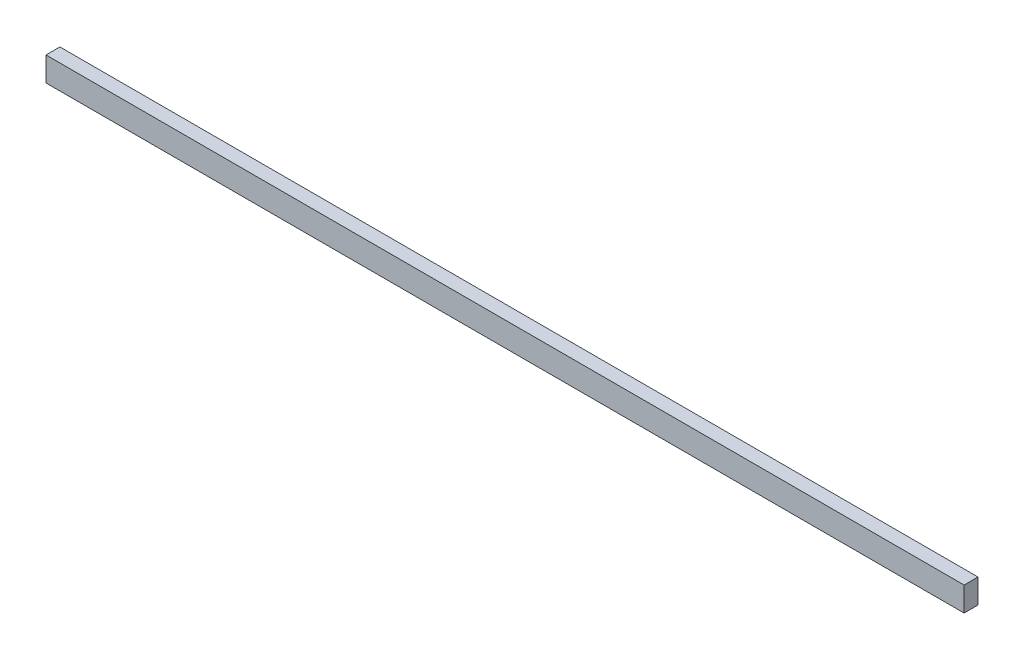
ISO-10303-21;
HEADER;
FILE_DESCRIPTION(('STEP AP214'),'2;1');
FILE_NAME('part.step','',(''),(''),'','','');
FILE_SCHEMA(('AUTOMOTIVE_DESIGN { 1 0 10303 214 1 1 1 1 }'));
ENDSEC;
DATA;
#1=APPLICATION_CONTEXT('core data for automotive mechanical design processes');
#2=APPLICATION_PROTOCOL_DEFINITION('international standard','automotive_design',2000,#1);
#3=PRODUCT_CONTEXT('',#1,'mechanical');
#4=PRODUCT('Part','Part','',(#3));
#5=PRODUCT_RELATED_PRODUCT_CATEGORY('part','',(#4));
#6=PRODUCT_DEFINITION_FORMATION('','',#4);
#7=PRODUCT_DEFINITION_CONTEXT('part definition',#1,'design');
#8=PRODUCT_DEFINITION('design','',#6,#7);
#9=PRODUCT_DEFINITION_SHAPE('','',#8);
#10=(LENGTH_UNIT() NAMED_UNIT(*) SI_UNIT(.MILLI.,.METRE.));
#11=(NAMED_UNIT(*) PLANE_ANGLE_UNIT() SI_UNIT($,.RADIAN.));
#12=(NAMED_UNIT(*) SI_UNIT($,.STERADIAN.) SOLID_ANGLE_UNIT());
#13=UNCERTAINTY_MEASURE_WITH_UNIT(LENGTH_MEASURE(1.E-05),#10,'distance_accuracy_value','');
#14=(GEOMETRIC_REPRESENTATION_CONTEXT(3) GLOBAL_UNCERTAINTY_ASSIGNED_CONTEXT((#13)) GLOBAL_UNIT_ASSIGNED_CONTEXT((#10,
#11,#12)) REPRESENTATION_CONTEXT('',''));
#15=CARTESIAN_POINT('',(0.,0.,0.));
#16=DIRECTION('',(0.,0.,1.));
#17=DIRECTION('',(1.,0.,0.));
#18=AXIS2_PLACEMENT_3D('',#15,#16,#17);
#19=CARTESIAN_POINT('',(-224.721483061842,14.,-5.82282757126729));
#20=DIRECTION('',(1.,0.,0.));
#21=DIRECTION('',(0.,0.,-1.));
#22=AXIS2_PLACEMENT_3D('',#19,#20,#21);
#23=PLANE('',#22);
#24=DIRECTION('',(0.,0.,1.));
#25=VECTOR('',#24,1.);
#26=CARTESIAN_POINT('',(-224.721483061842,0.,-5.82282757126729));
#27=LINE('',#26,#25);
#28=CARTESIAN_POINT('',(-224.721483061842,0.,-5.82282757126729));
#29=VERTEX_POINT('',#28);
#30=CARTESIAN_POINT('',(-224.721483061842,0.,2.17717242873271));
#31=VERTEX_POINT('',#30);
#32=EDGE_CURVE('E99',#29,#31,#27,.T.);
#33=ORIENTED_EDGE('',*,*,#32,.T.);
#34=DIRECTION('',(0.,-1.,0.));
#35=VECTOR('',#34,1.);
#36=CARTESIAN_POINT('',(-224.721483061842,14.,2.17717242873271));
#37=LINE('',#36,#35);
#38=CARTESIAN_POINT('',(-224.721483061842,14.,2.17717242873271));
#39=VERTEX_POINT('',#38);
#40=EDGE_CURVE('E11',#39,#31,#37,.T.);
#41=ORIENTED_EDGE('',*,*,#40,.F.);
#42=DIRECTION('',(0.,0.,1.));
#43=VECTOR('',#42,1.);
#44=CARTESIAN_POINT('',(-224.721483061842,14.,-5.82282757126729));
#45=LINE('',#44,#43);
#46=CARTESIAN_POINT('',(-224.721483061842,14.,-5.82282757126729));
#47=VERTEX_POINT('',#46);
#48=EDGE_CURVE('E87',#47,#39,#45,.T.);
#49=ORIENTED_EDGE('',*,*,#48,.F.);
#50=DIRECTION('',(0.,-1.,0.));
#51=VECTOR('',#50,1.);
#52=CARTESIAN_POINT('',(-224.721483061842,14.,-5.82282757126729));
#53=LINE('',#52,#51);
#54=EDGE_CURVE('E95',#47,#29,#53,.T.);
#55=ORIENTED_EDGE('',*,*,#54,.T.);
#56=EDGE_LOOP('',(#33,#41,#49,#55));
#57=FACE_BOUND('',#56,.T.);
#58=ADVANCED_FACE('F36',(#57),#23,.F.);
#59=CARTESIAN_POINT('',(-224.721483061842,14.,2.17717242873271));
#60=DIRECTION('',(0.,0.,-1.));
#61=DIRECTION('',(-1.,0.,0.));
#62=AXIS2_PLACEMENT_3D('',#59,#60,#61);
#63=PLANE('',#62);
#64=DIRECTION('',(1.,0.,0.));
#65=VECTOR('',#64,1.);
#66=CARTESIAN_POINT('',(-224.721483061842,0.,2.17717242873271));
#67=LINE('',#66,#65);
#68=CARTESIAN_POINT('',(304.278516938158,0.,2.17717242873271));
#69=VERTEX_POINT('',#68);
#70=EDGE_CURVE('E91',#31,#69,#67,.T.);
#71=ORIENTED_EDGE('',*,*,#70,.T.);
#72=DIRECTION('',(0.,-1.,0.));
#73=VECTOR('',#72,1.);
#74=CARTESIAN_POINT('',(304.278516938158,14.,2.17717242873271));
#75=LINE('',#74,#73);
#76=CARTESIAN_POINT('',(304.278516938158,14.,2.17717242873271));
#77=VERTEX_POINT('',#76);
#78=EDGE_CURVE('E44',#77,#69,#75,.T.);
#79=ORIENTED_EDGE('',*,*,#78,.F.);
#80=DIRECTION('',(1.,0.,0.));
#81=VECTOR('',#80,1.);
#82=CARTESIAN_POINT('',(-224.721483061842,14.,2.17717242873271));
#83=LINE('',#82,#81);
#84=EDGE_CURVE('E82',#39,#77,#83,.T.);
#85=ORIENTED_EDGE('',*,*,#84,.F.);
#86=ORIENTED_EDGE('',*,*,#40,.T.);
#87=EDGE_LOOP('',(#71,#79,#85,#86));
#88=FACE_BOUND('',#87,.T.);
#89=ADVANCED_FACE('F90',(#88),#63,.F.);
#90=CARTESIAN_POINT('',(304.278516938158,14.,-5.82282757126729));
#91=DIRECTION('',(-1.,0.,0.));
#92=DIRECTION('',(0.,0.,1.));
#93=AXIS2_PLACEMENT_3D('',#90,#91,#92);
#94=PLANE('',#93);
#95=DIRECTION('',(0.,0.,-1.));
#96=VECTOR('',#95,1.);
#97=CARTESIAN_POINT('',(304.278516938158,0.,-5.82282757126729));
#98=LINE('',#97,#96);
#99=CARTESIAN_POINT('',(304.278516938158,0.,-5.82282757126729));
#100=VERTEX_POINT('',#99);
#101=EDGE_CURVE('E69',#69,#100,#98,.T.);
#102=ORIENTED_EDGE('',*,*,#101,.T.);
#103=DIRECTION('',(0.,-1.,0.));
#104=VECTOR('',#103,1.);
#105=CARTESIAN_POINT('',(304.278516938158,14.,-5.82282757126729));
#106=LINE('',#105,#104);
#107=CARTESIAN_POINT('',(304.278516938158,14.,-5.82282757126729));
#108=VERTEX_POINT('',#107);
#109=EDGE_CURVE('E92',#108,#100,#106,.T.);
#110=ORIENTED_EDGE('',*,*,#109,.F.);
#111=DIRECTION('',(0.,0.,-1.));
#112=VECTOR('',#111,1.);
#113=CARTESIAN_POINT('',(304.278516938158,14.,-5.82282757126729));
#114=LINE('',#113,#112);
#115=EDGE_CURVE('E85',#77,#108,#114,.T.);
#116=ORIENTED_EDGE('',*,*,#115,.F.);
#117=ORIENTED_EDGE('',*,*,#78,.T.);
#118=EDGE_LOOP('',(#102,#110,#116,#117));
#119=FACE_BOUND('',#118,.T.);
#120=ADVANCED_FACE('F93',(#119),#94,.F.);
#121=CARTESIAN_POINT('',(-224.721483061842,14.,-5.82282757126729));
#122=DIRECTION('',(0.,0.,1.));
#123=DIRECTION('',(1.,0.,0.));
#124=AXIS2_PLACEMENT_3D('',#121,#122,#123);
#125=PLANE('',#124);
#126=DIRECTION('',(-1.,0.,0.));
#127=VECTOR('',#126,1.);
#128=CARTESIAN_POINT('',(-224.721483061842,0.,-5.82282757126729));
#129=LINE('',#128,#127);
#130=EDGE_CURVE('E75',#100,#29,#129,.T.);
#131=ORIENTED_EDGE('',*,*,#130,.T.);
#132=ORIENTED_EDGE('',*,*,#54,.F.);
#133=DIRECTION('',(-1.,0.,0.));
#134=VECTOR('',#133,1.);
#135=CARTESIAN_POINT('',(-224.721483061842,14.,-5.82282757126729));
#136=LINE('',#135,#134);
#137=EDGE_CURVE('E52',#108,#47,#136,.T.);
#138=ORIENTED_EDGE('',*,*,#137,.F.);
#139=ORIENTED_EDGE('',*,*,#109,.T.);
#140=EDGE_LOOP('',(#131,#132,#138,#139));
#141=FACE_BOUND('',#140,.T.);
#142=ADVANCED_FACE('F107',(#141),#125,.F.);
#143=CARTESIAN_POINT('',(0.,14.,0.));
#144=DIRECTION('',(0.,1.,0.));
#145=DIRECTION('',(0.,0.,1.));
#146=AXIS2_PLACEMENT_3D('',#143,#144,#145);
#147=PLANE('',#146);
#148=ORIENTED_EDGE('',*,*,#48,.T.);
#149=ORIENTED_EDGE('',*,*,#84,.T.);
#150=ORIENTED_EDGE('',*,*,#115,.T.);
#151=ORIENTED_EDGE('',*,*,#137,.T.);
#152=EDGE_LOOP('',(#148,#149,#150,#151));
#153=FACE_BOUND('',#152,.T.);
#154=ADVANCED_FACE('F83',(#153),#147,.T.);
#155=CARTESIAN_POINT('',(0.,0.,0.));
#156=DIRECTION('',(0.,1.,0.));
#157=DIRECTION('',(0.,0.,1.));
#158=AXIS2_PLACEMENT_3D('',#155,#156,#157);
#159=PLANE('',#158);
#160=CARTESIAN_POINT('',(-208.721483061842,0.,-1.82282757126729));
#161=DIRECTION('',(0.,-1.,0.));
#162=DIRECTION('',(0.,0.,-1.));
#163=AXIS2_PLACEMENT_3D('',#160,#161,#162);
#164=CIRCLE('',#163,2.);
#165=CARTESIAN_POINT('',(-208.721483061842,0.,-3.82282757126728));
#166=VERTEX_POINT('',#165);
#167=EDGE_CURVE('E119',#166,#166,#164,.T.);
#168=ORIENTED_EDGE('',*,*,#167,.F.);
#169=EDGE_LOOP('',(#168));
#170=FACE_BOUND('',#169,.T.);
#171=CARTESIAN_POINT('',(288.278516938158,0.,-1.82282757126729));
#172=DIRECTION('',(0.,-1.,0.));
#173=DIRECTION('',(0.,0.,-1.));
#174=AXIS2_PLACEMENT_3D('',#171,#172,#173);
#175=CIRCLE('',#174,2.);
#176=CARTESIAN_POINT('',(288.278516938158,0.,-3.82282757126728));
#177=VERTEX_POINT('',#176);
#178=EDGE_CURVE('E113',#177,#177,#175,.T.);
#179=ORIENTED_EDGE('',*,*,#178,.F.);
#180=EDGE_LOOP('',(#179));
#181=FACE_BOUND('',#180,.T.);
#182=ORIENTED_EDGE('',*,*,#32,.F.);
#183=ORIENTED_EDGE('',*,*,#130,.F.);
#184=ORIENTED_EDGE('',*,*,#101,.F.);
#185=ORIENTED_EDGE('',*,*,#70,.F.);
#186=EDGE_LOOP('',(#182,#183,#184,#185));
#187=FACE_BOUND('',#186,.T.);
#188=ADVANCED_FACE('F110',(#170,#181,#187),#159,.F.);
#189=CARTESIAN_POINT('',(288.278516938158,10.,-1.82282757126729));
#190=DIRECTION('',(0.,-1.,0.));
#191=DIRECTION('',(0.,0.,-1.));
#192=AXIS2_PLACEMENT_3D('',#189,#190,#191);
#193=CYLINDRICAL_SURFACE('',#192,2.);
#194=CARTESIAN_POINT('',(288.278516938158,10.,-1.82282757126729));
#195=DIRECTION('',(0.,-1.,0.));
#196=DIRECTION('',(0.,0.,-1.));
#197=AXIS2_PLACEMENT_3D('',#194,#195,#196);
#198=CIRCLE('',#197,2.);
#199=CARTESIAN_POINT('',(288.278516938158,10.,-3.82282757126728));
#200=VERTEX_POINT('',#199);
#201=EDGE_CURVE('E116',#200,#200,#198,.T.);
#202=ORIENTED_EDGE('',*,*,#201,.F.);
#203=EDGE_LOOP('',(#202));
#204=FACE_BOUND('',#203,.T.);
#205=ORIENTED_EDGE('',*,*,#178,.T.);
#206=EDGE_LOOP('',(#205));
#207=FACE_BOUND('',#206,.T.);
#208=ADVANCED_FACE('F136',(#204,#207),#193,.F.);
#209=CARTESIAN_POINT('',(288.278516938158,10.,-1.82282757126729));
#210=DIRECTION('',(0.,-1.,0.));
#211=DIRECTION('',(0.,0.,-1.));
#212=AXIS2_PLACEMENT_3D('',#209,#210,#211);
#213=PLANE('',#212);
#214=ORIENTED_EDGE('',*,*,#201,.T.);
#215=EDGE_LOOP('',(#214));
#216=FACE_BOUND('',#215,.T.);
#217=ADVANCED_FACE('F130',(#216),#213,.T.);
#218=CARTESIAN_POINT('',(-208.721483061842,10.,-1.82282757126729));
#219=DIRECTION('',(0.,-1.,0.));
#220=DIRECTION('',(0.,0.,-1.));
#221=AXIS2_PLACEMENT_3D('',#218,#219,#220);
#222=CYLINDRICAL_SURFACE('',#221,2.);
#223=CARTESIAN_POINT('',(-208.721483061842,10.,-1.82282757126729));
#224=DIRECTION('',(0.,-1.,0.));
#225=DIRECTION('',(0.,0.,-1.));
#226=AXIS2_PLACEMENT_3D('',#223,#224,#225);
#227=CIRCLE('',#226,2.);
#228=CARTESIAN_POINT('',(-208.721483061842,10.,-3.82282757126728));
#229=VERTEX_POINT('',#228);
#230=EDGE_CURVE('E102',#229,#229,#227,.T.);
#231=ORIENTED_EDGE('',*,*,#230,.F.);
#232=EDGE_LOOP('',(#231));
#233=FACE_BOUND('',#232,.T.);
#234=ORIENTED_EDGE('',*,*,#167,.T.);
#235=EDGE_LOOP('',(#234));
#236=FACE_BOUND('',#235,.T.);
#237=ADVANCED_FACE('F127',(#233,#236),#222,.F.);
#238=CARTESIAN_POINT('',(-208.721483061842,10.,-1.82282757126729));
#239=DIRECTION('',(0.,-1.,0.));
#240=DIRECTION('',(0.,0.,-1.));
#241=AXIS2_PLACEMENT_3D('',#238,#239,#240);
#242=PLANE('',#241);
#243=ORIENTED_EDGE('',*,*,#230,.T.);
#244=EDGE_LOOP('',(#243));
#245=FACE_BOUND('',#244,.T.);
#246=ADVANCED_FACE('F125',(#245),#242,.T.);
#247=CLOSED_SHELL('',(#58,#89,#120,#142,#154,#188,#208,#217,#237,#246));
#248=MANIFOLD_SOLID_BREP('B2',#247);
#249=ADVANCED_BREP_SHAPE_REPRESENTATION('',(#18,#248),#14);
#250=SHAPE_DEFINITION_REPRESENTATION(#9,#249);
ENDSEC;
END-ISO-10303-21;
